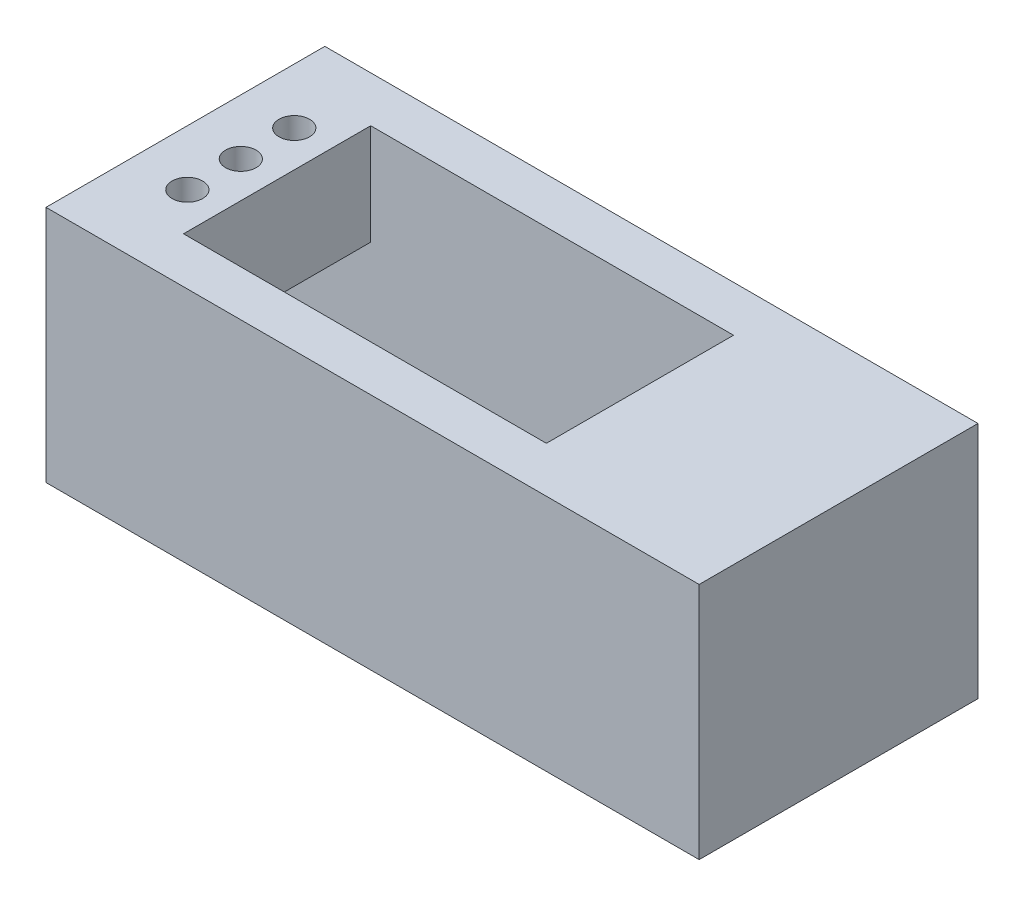
ISO-10303-21;
HEADER;
FILE_DESCRIPTION(('STEP AP214'),'2;1');
FILE_NAME('part.step','',(''),(''),'','','');
FILE_SCHEMA(('AUTOMOTIVE_DESIGN { 1 0 10303 214 1 1 1 1 }'));
ENDSEC;
DATA;
#1=APPLICATION_CONTEXT('core data for automotive mechanical design processes');
#2=APPLICATION_PROTOCOL_DEFINITION('international standard','automotive_design',2000,#1);
#3=PRODUCT_CONTEXT('',#1,'mechanical');
#4=PRODUCT('Part','Part','',(#3));
#5=PRODUCT_RELATED_PRODUCT_CATEGORY('part','',(#4));
#6=PRODUCT_DEFINITION_FORMATION('','',#4);
#7=PRODUCT_DEFINITION_CONTEXT('part definition',#1,'design');
#8=PRODUCT_DEFINITION('design','',#6,#7);
#9=PRODUCT_DEFINITION_SHAPE('','',#8);
#10=(LENGTH_UNIT() NAMED_UNIT(*) SI_UNIT(.MILLI.,.METRE.));
#11=(NAMED_UNIT(*) PLANE_ANGLE_UNIT() SI_UNIT($,.RADIAN.));
#12=(NAMED_UNIT(*) SI_UNIT($,.STERADIAN.) SOLID_ANGLE_UNIT());
#13=UNCERTAINTY_MEASURE_WITH_UNIT(LENGTH_MEASURE(1.E-05),#10,'distance_accuracy_value','');
#14=(GEOMETRIC_REPRESENTATION_CONTEXT(3) GLOBAL_UNCERTAINTY_ASSIGNED_CONTEXT((#13)) GLOBAL_UNIT_ASSIGNED_CONTEXT((#10,
#11,#12)) REPRESENTATION_CONTEXT('',''));
#15=CARTESIAN_POINT('',(0.,0.,0.));
#16=DIRECTION('',(0.,0.,1.));
#17=DIRECTION('',(1.,0.,0.));
#18=AXIS2_PLACEMENT_3D('',#15,#16,#17);
#19=CARTESIAN_POINT('',(-11.875,15.6,6.125));
#20=DIRECTION('',(1.,0.,0.));
#21=DIRECTION('',(0.,0.,-1.));
#22=AXIS2_PLACEMENT_3D('',#19,#20,#21);
#23=PLANE('',#22);
#24=DIRECTION('',(0.,-1.,0.));
#25=VECTOR('',#24,1.);
#26=CARTESIAN_POINT('',(-11.875,15.6,6.125));
#27=LINE('',#26,#25);
#28=CARTESIAN_POINT('',(-11.875,15.6,6.125));
#29=VERTEX_POINT('',#28);
#30=CARTESIAN_POINT('',(-11.875,9.,6.125));
#31=VERTEX_POINT('',#30);
#32=EDGE_CURVE('E63',#29,#31,#27,.T.);
#33=ORIENTED_EDGE('',*,*,#32,.T.);
#34=DIRECTION('',(0.,0.,-1.));
#35=VECTOR('',#34,1.);
#36=CARTESIAN_POINT('',(-11.875,9.,6.125));
#37=LINE('',#36,#35);
#38=CARTESIAN_POINT('',(-11.875,9.,-6.125));
#39=VERTEX_POINT('',#38);
#40=EDGE_CURVE('E121',#31,#39,#37,.T.);
#41=ORIENTED_EDGE('',*,*,#40,.T.);
#42=DIRECTION('',(0.,-1.,0.));
#43=VECTOR('',#42,1.);
#44=CARTESIAN_POINT('',(-11.875,15.6,-6.125));
#45=LINE('',#44,#43);
#46=CARTESIAN_POINT('',(-11.875,15.6,-6.125));
#47=VERTEX_POINT('',#46);
#48=EDGE_CURVE('E174',#47,#39,#45,.T.);
#49=ORIENTED_EDGE('',*,*,#48,.F.);
#50=DIRECTION('',(0.,0.,1.));
#51=VECTOR('',#50,1.);
#52=CARTESIAN_POINT('',(-11.875,15.6,6.125));
#53=LINE('',#52,#51);
#54=EDGE_CURVE('E155',#47,#29,#53,.T.);
#55=ORIENTED_EDGE('',*,*,#54,.T.);
#56=EDGE_LOOP('',(#33,#41,#49,#55));
#57=FACE_BOUND('',#56,.T.);
#58=ADVANCED_FACE('F39',(#57),#23,.T.);
#59=CARTESIAN_POINT('',(0.,15.6,0.));
#60=DIRECTION('',(0.,1.,0.));
#61=DIRECTION('',(0.,0.,1.));
#62=AXIS2_PLACEMENT_3D('',#59,#60,#61);
#63=PLANE('',#62);
#64=CARTESIAN_POINT('',(-14.245,15.6,-3.495));
#65=DIRECTION('',(0.,1.,0.));
#66=DIRECTION('',(0.,0.,1.));
#67=AXIS2_PLACEMENT_3D('',#64,#65,#66);
#68=CIRCLE('',#67,1.);
#69=CARTESIAN_POINT('',(-14.245,15.6,-2.495));
#70=VERTEX_POINT('',#69);
#71=EDGE_CURVE('E405',#70,#70,#68,.T.);
#72=ORIENTED_EDGE('',*,*,#71,.F.);
#73=EDGE_LOOP('',(#72));
#74=FACE_BOUND('',#73,.T.);
#75=CARTESIAN_POINT('',(-14.245,15.6,0.00500000000000023));
#76=DIRECTION('',(0.,1.,0.));
#77=DIRECTION('',(0.,0.,1.));
#78=AXIS2_PLACEMENT_3D('',#75,#76,#77);
#79=CIRCLE('',#78,1.);
#80=CARTESIAN_POINT('',(-14.245,15.6,1.005));
#81=VERTEX_POINT('',#80);
#82=EDGE_CURVE('E415',#81,#81,#79,.T.);
#83=ORIENTED_EDGE('',*,*,#82,.F.);
#84=EDGE_LOOP('',(#83));
#85=FACE_BOUND('',#84,.T.);
#86=CARTESIAN_POINT('',(-14.245,15.6,3.505));
#87=DIRECTION('',(0.,1.,0.));
#88=DIRECTION('',(0.,0.,1.));
#89=AXIS2_PLACEMENT_3D('',#86,#87,#88);
#90=CIRCLE('',#89,1.);
#91=CARTESIAN_POINT('',(-14.245,15.6,4.505));
#92=VERTEX_POINT('',#91);
#93=EDGE_CURVE('E422',#92,#92,#90,.T.);
#94=ORIENTED_EDGE('',*,*,#93,.F.);
#95=EDGE_LOOP('',(#94));
#96=FACE_BOUND('',#95,.T.);
#97=DIRECTION('',(1.,0.,0.));
#98=VECTOR('',#97,1.);
#99=CARTESIAN_POINT('',(-17.875,15.6,9.125));
#100=LINE('',#99,#98);
#101=CARTESIAN_POINT('',(-17.875,15.6,9.125));
#102=VERTEX_POINT('',#101);
#103=CARTESIAN_POINT('',(24.875,15.6,9.125));
#104=VERTEX_POINT('',#103);
#105=EDGE_CURVE('E183',#102,#104,#100,.T.);
#106=ORIENTED_EDGE('',*,*,#105,.T.);
#107=DIRECTION('',(0.,0.,-1.));
#108=VECTOR('',#107,1.);
#109=CARTESIAN_POINT('',(24.875,15.6,9.125));
#110=LINE('',#109,#108);
#111=CARTESIAN_POINT('',(24.875,15.6,-9.125));
#112=VERTEX_POINT('',#111);
#113=EDGE_CURVE('E186',#104,#112,#110,.T.);
#114=ORIENTED_EDGE('',*,*,#113,.T.);
#115=DIRECTION('',(-1.,0.,0.));
#116=VECTOR('',#115,1.);
#117=CARTESIAN_POINT('',(24.875,15.6,-9.125));
#118=LINE('',#117,#116);
#119=CARTESIAN_POINT('',(-17.875,15.6,-9.125));
#120=VERTEX_POINT('',#119);
#121=EDGE_CURVE('E190',#112,#120,#118,.T.);
#122=ORIENTED_EDGE('',*,*,#121,.T.);
#123=DIRECTION('',(0.,0.,1.));
#124=VECTOR('',#123,1.);
#125=CARTESIAN_POINT('',(-17.875,15.6,-9.125));
#126=LINE('',#125,#124);
#127=EDGE_CURVE('E193',#120,#102,#126,.T.);
#128=ORIENTED_EDGE('',*,*,#127,.T.);
#129=EDGE_LOOP('',(#106,#114,#122,#128));
#130=FACE_BOUND('',#129,.T.);
#131=DIRECTION('',(-1.,0.,0.));
#132=VECTOR('',#131,1.);
#133=CARTESIAN_POINT('',(-11.875,15.6,-6.125));
#134=LINE('',#133,#132);
#135=CARTESIAN_POINT('',(11.875,15.6,-6.125));
#136=VERTEX_POINT('',#135);
#137=EDGE_CURVE('E152',#136,#47,#134,.T.);
#138=ORIENTED_EDGE('',*,*,#137,.F.);
#139=DIRECTION('',(0.,0.,-1.));
#140=VECTOR('',#139,1.);
#141=CARTESIAN_POINT('',(11.875,15.6,6.125));
#142=LINE('',#141,#140);
#143=CARTESIAN_POINT('',(11.875,15.6,6.125));
#144=VERTEX_POINT('',#143);
#145=EDGE_CURVE('E149',#144,#136,#142,.T.);
#146=ORIENTED_EDGE('',*,*,#145,.F.);
#147=DIRECTION('',(1.,0.,0.));
#148=VECTOR('',#147,1.);
#149=CARTESIAN_POINT('',(-11.875,15.6,6.125));
#150=LINE('',#149,#148);
#151=EDGE_CURVE('E158',#29,#144,#150,.T.);
#152=ORIENTED_EDGE('',*,*,#151,.F.);
#153=ORIENTED_EDGE('',*,*,#54,.F.);
#154=EDGE_LOOP('',(#138,#146,#152,#153));
#155=FACE_BOUND('',#154,.T.);
#156=ADVANCED_FACE('F235',(#74,#85,#96,#130,#155),#63,.T.);
#157=CARTESIAN_POINT('',(0.,0.,0.));
#158=DIRECTION('',(0.,1.,0.));
#159=DIRECTION('',(0.,0.,1.));
#160=AXIS2_PLACEMENT_3D('',#157,#158,#159);
#161=PLANE('',#160);
#162=DIRECTION('',(0.,0.,1.));
#163=VECTOR('',#162,1.);
#164=CARTESIAN_POINT('',(-17.875,0.,-9.125));
#165=LINE('',#164,#163);
#166=CARTESIAN_POINT('',(-17.875,0.,6.125));
#167=VERTEX_POINT('',#166);
#168=CARTESIAN_POINT('',(-17.875,0.,9.125));
#169=VERTEX_POINT('',#168);
#170=EDGE_CURVE('E206',#167,#169,#165,.T.);
#171=ORIENTED_EDGE('',*,*,#170,.F.);
#172=DIRECTION('',(1.,0.,0.));
#173=VECTOR('',#172,1.);
#174=CARTESIAN_POINT('',(-11.875,0.,6.125));
#175=LINE('',#174,#173);
#176=CARTESIAN_POINT('',(11.875,0.,6.125));
#177=VERTEX_POINT('',#176);
#178=EDGE_CURVE('E129',#167,#177,#175,.T.);
#179=ORIENTED_EDGE('',*,*,#178,.T.);
#180=DIRECTION('',(0.,0.,-1.));
#181=VECTOR('',#180,1.);
#182=CARTESIAN_POINT('',(11.875,0.,6.125));
#183=LINE('',#182,#181);
#184=CARTESIAN_POINT('',(11.875,0.,-6.125));
#185=VERTEX_POINT('',#184);
#186=EDGE_CURVE('E148',#177,#185,#183,.T.);
#187=ORIENTED_EDGE('',*,*,#186,.T.);
#188=DIRECTION('',(-1.,0.,0.));
#189=VECTOR('',#188,1.);
#190=CARTESIAN_POINT('',(-11.875,0.,-6.125));
#191=LINE('',#190,#189);
#192=CARTESIAN_POINT('',(-17.875,0.,-6.125));
#193=VERTEX_POINT('',#192);
#194=EDGE_CURVE('E165',#185,#193,#191,.T.);
#195=ORIENTED_EDGE('',*,*,#194,.T.);
#196=CARTESIAN_POINT('',(-17.875,0.,-9.125));
#197=VERTEX_POINT('',#196);
#198=EDGE_CURVE('E187',#197,#193,#165,.T.);
#199=ORIENTED_EDGE('',*,*,#198,.F.);
#200=DIRECTION('',(-1.,0.,0.));
#201=VECTOR('',#200,1.);
#202=CARTESIAN_POINT('',(-17.875,0.,-9.125));
#203=LINE('',#202,#201);
#204=CARTESIAN_POINT('',(24.875,0.,-9.125));
#205=VERTEX_POINT('',#204);
#206=EDGE_CURVE('E203',#205,#197,#203,.T.);
#207=ORIENTED_EDGE('',*,*,#206,.F.);
#208=DIRECTION('',(0.,0.,-1.));
#209=VECTOR('',#208,1.);
#210=CARTESIAN_POINT('',(24.875,0.,9.125));
#211=LINE('',#210,#209);
#212=CARTESIAN_POINT('',(24.875,0.,9.125));
#213=VERTEX_POINT('',#212);
#214=EDGE_CURVE('E199',#213,#205,#211,.T.);
#215=ORIENTED_EDGE('',*,*,#214,.F.);
#216=DIRECTION('',(1.,0.,0.));
#217=VECTOR('',#216,1.);
#218=CARTESIAN_POINT('',(17.875,0.,9.125));
#219=LINE('',#218,#217);
#220=EDGE_CURVE('E182',#169,#213,#219,.T.);
#221=ORIENTED_EDGE('',*,*,#220,.F.);
#222=EDGE_LOOP('',(#171,#179,#187,#195,#199,#207,#215,#221));
#223=FACE_BOUND('',#222,.T.);
#224=ADVANCED_FACE('F229',(#223),#161,.F.);
#225=CARTESIAN_POINT('',(17.875,15.6,9.125));
#226=DIRECTION('',(0.,0.,-1.));
#227=DIRECTION('',(-1.,0.,0.));
#228=AXIS2_PLACEMENT_3D('',#225,#226,#227);
#229=PLANE('',#228);
#230=ORIENTED_EDGE('',*,*,#220,.T.);
#231=DIRECTION('',(0.,-1.,0.));
#232=VECTOR('',#231,1.);
#233=CARTESIAN_POINT('',(24.875,15.6,9.125));
#234=LINE('',#233,#232);
#235=EDGE_CURVE('E11',#104,#213,#234,.T.);
#236=ORIENTED_EDGE('',*,*,#235,.F.);
#237=ORIENTED_EDGE('',*,*,#105,.F.);
#238=DIRECTION('',(0.,-1.,0.));
#239=VECTOR('',#238,1.);
#240=CARTESIAN_POINT('',(-17.875,15.6,9.125));
#241=LINE('',#240,#239);
#242=EDGE_CURVE('E196',#102,#169,#241,.T.);
#243=ORIENTED_EDGE('',*,*,#242,.T.);
#244=EDGE_LOOP('',(#230,#236,#237,#243));
#245=FACE_BOUND('',#244,.T.);
#246=ADVANCED_FACE('F41',(#245),#229,.F.);
#247=CARTESIAN_POINT('',(24.875,15.6,9.125));
#248=DIRECTION('',(-1.,0.,0.));
#249=DIRECTION('',(0.,0.,1.));
#250=AXIS2_PLACEMENT_3D('',#247,#248,#249);
#251=PLANE('',#250);
#252=ORIENTED_EDGE('',*,*,#214,.T.);
#253=DIRECTION('',(0.,-1.,0.));
#254=VECTOR('',#253,1.);
#255=CARTESIAN_POINT('',(24.875,15.6,-9.125));
#256=LINE('',#255,#254);
#257=EDGE_CURVE('E48',#112,#205,#256,.T.);
#258=ORIENTED_EDGE('',*,*,#257,.F.);
#259=ORIENTED_EDGE('',*,*,#113,.F.);
#260=ORIENTED_EDGE('',*,*,#235,.T.);
#261=EDGE_LOOP('',(#252,#258,#259,#260));
#262=FACE_BOUND('',#261,.T.);
#263=ADVANCED_FACE('F224',(#262),#251,.F.);
#264=CARTESIAN_POINT('',(-17.875,15.6,-9.125));
#265=DIRECTION('',(0.,0.,1.));
#266=DIRECTION('',(1.,0.,0.));
#267=AXIS2_PLACEMENT_3D('',#264,#265,#266);
#268=PLANE('',#267);
#269=ORIENTED_EDGE('',*,*,#206,.T.);
#270=DIRECTION('',(0.,-1.,0.));
#271=VECTOR('',#270,1.);
#272=CARTESIAN_POINT('',(-17.875,15.6,-9.125));
#273=LINE('',#272,#271);
#274=EDGE_CURVE('E212',#120,#197,#273,.T.);
#275=ORIENTED_EDGE('',*,*,#274,.F.);
#276=ORIENTED_EDGE('',*,*,#121,.F.);
#277=ORIENTED_EDGE('',*,*,#257,.T.);
#278=EDGE_LOOP('',(#269,#275,#276,#277));
#279=FACE_BOUND('',#278,.T.);
#280=ADVANCED_FACE('F220',(#279),#268,.F.);
#281=CARTESIAN_POINT('',(-17.875,15.6,-9.125));
#282=DIRECTION('',(1.,0.,0.));
#283=DIRECTION('',(0.,0.,-1.));
#284=AXIS2_PLACEMENT_3D('',#281,#282,#283);
#285=PLANE('',#284);
#286=DIRECTION('',(0.,0.,1.));
#287=VECTOR('',#286,1.);
#288=CARTESIAN_POINT('',(-17.875,9.,-6.125));
#289=LINE('',#288,#287);
#290=CARTESIAN_POINT('',(-17.875,9.,-6.125));
#291=VERTEX_POINT('',#290);
#292=CARTESIAN_POINT('',(-17.875,9.,6.125));
#293=VERTEX_POINT('',#292);
#294=EDGE_CURVE('E119',#291,#293,#289,.T.);
#295=ORIENTED_EDGE('',*,*,#294,.T.);
#296=DIRECTION('',(0.,1.,0.));
#297=VECTOR('',#296,1.);
#298=CARTESIAN_POINT('',(-17.875,0.,6.125));
#299=LINE('',#298,#297);
#300=EDGE_CURVE('E126',#167,#293,#299,.T.);
#301=ORIENTED_EDGE('',*,*,#300,.F.);
#302=ORIENTED_EDGE('',*,*,#170,.T.);
#303=ORIENTED_EDGE('',*,*,#242,.F.);
#304=ORIENTED_EDGE('',*,*,#127,.F.);
#305=ORIENTED_EDGE('',*,*,#274,.T.);
#306=ORIENTED_EDGE('',*,*,#198,.T.);
#307=DIRECTION('',(0.,1.,0.));
#308=VECTOR('',#307,1.);
#309=CARTESIAN_POINT('',(-17.875,0.,-6.125));
#310=LINE('',#309,#308);
#311=EDGE_CURVE('E123',#193,#291,#310,.T.);
#312=ORIENTED_EDGE('',*,*,#311,.T.);
#313=EDGE_LOOP('',(#295,#301,#302,#303,#304,#305,#306,#312));
#314=FACE_BOUND('',#313,.T.);
#315=ADVANCED_FACE('F135',(#314),#285,.F.);
#316=CARTESIAN_POINT('',(11.875,15.6,6.125));
#317=DIRECTION('',(-1.,0.,0.));
#318=DIRECTION('',(0.,0.,1.));
#319=AXIS2_PLACEMENT_3D('',#316,#317,#318);
#320=PLANE('',#319);
#321=ORIENTED_EDGE('',*,*,#186,.F.);
#322=DIRECTION('',(0.,-1.,0.));
#323=VECTOR('',#322,1.);
#324=CARTESIAN_POINT('',(11.875,15.6,6.125));
#325=LINE('',#324,#323);
#326=EDGE_CURVE('E161',#144,#177,#325,.T.);
#327=ORIENTED_EDGE('',*,*,#326,.F.);
#328=ORIENTED_EDGE('',*,*,#145,.T.);
#329=DIRECTION('',(0.,-1.,0.));
#330=VECTOR('',#329,1.);
#331=CARTESIAN_POINT('',(11.875,15.6,-6.125));
#332=LINE('',#331,#330);
#333=EDGE_CURVE('E178',#136,#185,#332,.T.);
#334=ORIENTED_EDGE('',*,*,#333,.T.);
#335=EDGE_LOOP('',(#321,#327,#328,#334));
#336=FACE_BOUND('',#335,.T.);
#337=ADVANCED_FACE('F258',(#336),#320,.T.);
#338=CARTESIAN_POINT('',(-11.875,15.6,-6.125));
#339=DIRECTION('',(0.,0.,1.));
#340=DIRECTION('',(1.,0.,0.));
#341=AXIS2_PLACEMENT_3D('',#338,#339,#340);
#342=PLANE('',#341);
#343=ORIENTED_EDGE('',*,*,#48,.T.);
#344=DIRECTION('',(-1.,0.,0.));
#345=VECTOR('',#344,1.);
#346=CARTESIAN_POINT('',(-7.875,9.,-6.125));
#347=LINE('',#346,#345);
#348=EDGE_CURVE('E55',#39,#291,#347,.T.);
#349=ORIENTED_EDGE('',*,*,#348,.T.);
#350=ORIENTED_EDGE('',*,*,#311,.F.);
#351=ORIENTED_EDGE('',*,*,#194,.F.);
#352=ORIENTED_EDGE('',*,*,#333,.F.);
#353=ORIENTED_EDGE('',*,*,#137,.T.);
#354=EDGE_LOOP('',(#343,#349,#350,#351,#352,#353));
#355=FACE_BOUND('',#354,.T.);
#356=ADVANCED_FACE('F255',(#355),#342,.T.);
#357=CARTESIAN_POINT('',(-11.875,15.6,6.125));
#358=DIRECTION('',(0.,0.,-1.));
#359=DIRECTION('',(-1.,0.,0.));
#360=AXIS2_PLACEMENT_3D('',#357,#358,#359);
#361=PLANE('',#360);
#362=ORIENTED_EDGE('',*,*,#178,.F.);
#363=ORIENTED_EDGE('',*,*,#300,.T.);
#364=DIRECTION('',(-1.,0.,0.));
#365=VECTOR('',#364,1.);
#366=CARTESIAN_POINT('',(-7.875,9.,6.125));
#367=LINE('',#366,#365);
#368=EDGE_CURVE('E115',#31,#293,#367,.T.);
#369=ORIENTED_EDGE('',*,*,#368,.F.);
#370=ORIENTED_EDGE('',*,*,#32,.F.);
#371=ORIENTED_EDGE('',*,*,#151,.T.);
#372=ORIENTED_EDGE('',*,*,#326,.T.);
#373=EDGE_LOOP('',(#362,#363,#369,#370,#371,#372));
#374=FACE_BOUND('',#373,.T.);
#375=ADVANCED_FACE('F127',(#374),#361,.T.);
#376=CARTESIAN_POINT('',(-7.875,9.,-6.125));
#377=DIRECTION('',(0.,-1.,0.));
#378=DIRECTION('',(0.,0.,-1.));
#379=AXIS2_PLACEMENT_3D('',#376,#377,#378);
#380=PLANE('',#379);
#381=ORIENTED_EDGE('',*,*,#368,.T.);
#382=ORIENTED_EDGE('',*,*,#294,.F.);
#383=ORIENTED_EDGE('',*,*,#348,.F.);
#384=ORIENTED_EDGE('',*,*,#40,.F.);
#385=EDGE_LOOP('',(#381,#382,#383,#384));
#386=FACE_BOUND('',#385,.T.);
#387=ADVANCED_FACE('F117',(#386),#380,.T.);
#388=CARTESIAN_POINT('',(-14.245,12.6,3.505));
#389=DIRECTION('',(0.,1.,0.));
#390=DIRECTION('',(0.,0.,1.));
#391=AXIS2_PLACEMENT_3D('',#388,#389,#390);
#392=CYLINDRICAL_SURFACE('',#391,1.);
#393=CARTESIAN_POINT('',(-14.245,12.6,3.505));
#394=DIRECTION('',(0.,1.,0.));
#395=DIRECTION('',(0.,0.,1.));
#396=AXIS2_PLACEMENT_3D('',#393,#394,#395);
#397=CIRCLE('',#396,1.);
#398=CARTESIAN_POINT('',(-14.245,12.6,4.505));
#399=VERTEX_POINT('',#398);
#400=EDGE_CURVE('E419',#399,#399,#397,.T.);
#401=ORIENTED_EDGE('',*,*,#400,.F.);
#402=EDGE_LOOP('',(#401));
#403=FACE_BOUND('',#402,.T.);
#404=ORIENTED_EDGE('',*,*,#93,.T.);
#405=EDGE_LOOP('',(#404));
#406=FACE_BOUND('',#405,.T.);
#407=ADVANCED_FACE('F294',(#403,#406),#392,.F.);
#408=CARTESIAN_POINT('',(-14.245,12.6,3.505));
#409=DIRECTION('',(0.,1.,0.));
#410=DIRECTION('',(0.,0.,1.));
#411=AXIS2_PLACEMENT_3D('',#408,#409,#410);
#412=PLANE('',#411);
#413=ORIENTED_EDGE('',*,*,#400,.T.);
#414=EDGE_LOOP('',(#413));
#415=FACE_BOUND('',#414,.T.);
#416=ADVANCED_FACE('F301',(#415),#412,.T.);
#417=CARTESIAN_POINT('',(-14.245,12.6,0.00500000000000023));
#418=DIRECTION('',(0.,1.,0.));
#419=DIRECTION('',(0.,0.,1.));
#420=AXIS2_PLACEMENT_3D('',#417,#418,#419);
#421=CYLINDRICAL_SURFACE('',#420,1.);
#422=CARTESIAN_POINT('',(-14.245,12.6,0.00500000000000023));
#423=DIRECTION('',(0.,1.,0.));
#424=DIRECTION('',(0.,0.,1.));
#425=AXIS2_PLACEMENT_3D('',#422,#423,#424);
#426=CIRCLE('',#425,1.);
#427=CARTESIAN_POINT('',(-14.245,12.6,1.005));
#428=VERTEX_POINT('',#427);
#429=EDGE_CURVE('E409',#428,#428,#426,.T.);
#430=ORIENTED_EDGE('',*,*,#429,.F.);
#431=EDGE_LOOP('',(#430));
#432=FACE_BOUND('',#431,.T.);
#433=ORIENTED_EDGE('',*,*,#82,.T.);
#434=EDGE_LOOP('',(#433));
#435=FACE_BOUND('',#434,.T.);
#436=ADVANCED_FACE('F309',(#432,#435),#421,.F.);
#437=CARTESIAN_POINT('',(-14.245,12.6,0.00500000000000023));
#438=DIRECTION('',(0.,1.,0.));
#439=DIRECTION('',(0.,0.,1.));
#440=AXIS2_PLACEMENT_3D('',#437,#438,#439);
#441=PLANE('',#440);
#442=ORIENTED_EDGE('',*,*,#429,.T.);
#443=EDGE_LOOP('',(#442));
#444=FACE_BOUND('',#443,.T.);
#445=ADVANCED_FACE('F317',(#444),#441,.T.);
#446=CARTESIAN_POINT('',(-14.245,12.6,-3.495));
#447=DIRECTION('',(0.,1.,0.));
#448=DIRECTION('',(0.,0.,1.));
#449=AXIS2_PLACEMENT_3D('',#446,#447,#448);
#450=CYLINDRICAL_SURFACE('',#449,1.);
#451=CARTESIAN_POINT('',(-14.245,12.6,-3.495));
#452=DIRECTION('',(0.,1.,0.));
#453=DIRECTION('',(0.,0.,1.));
#454=AXIS2_PLACEMENT_3D('',#451,#452,#453);
#455=CIRCLE('',#454,1.);
#456=CARTESIAN_POINT('',(-14.245,12.6,-2.495));
#457=VERTEX_POINT('',#456);
#458=EDGE_CURVE('E133',#457,#457,#455,.T.);
#459=ORIENTED_EDGE('',*,*,#458,.F.);
#460=EDGE_LOOP('',(#459));
#461=FACE_BOUND('',#460,.T.);
#462=ORIENTED_EDGE('',*,*,#71,.T.);
#463=EDGE_LOOP('',(#462));
#464=FACE_BOUND('',#463,.T.);
#465=ADVANCED_FACE('F325',(#461,#464),#450,.F.);
#466=CARTESIAN_POINT('',(-14.245,12.6,-3.495));
#467=DIRECTION('',(0.,1.,0.));
#468=DIRECTION('',(0.,0.,1.));
#469=AXIS2_PLACEMENT_3D('',#466,#467,#468);
#470=PLANE('',#469);
#471=ORIENTED_EDGE('',*,*,#458,.T.);
#472=EDGE_LOOP('',(#471));
#473=FACE_BOUND('',#472,.T.);
#474=ADVANCED_FACE('F333',(#473),#470,.T.);
#475=CLOSED_SHELL('',(#58,#156,#224,#246,#263,#280,#315,#337,#356,#375,#387,#407,#416,#436,#445,
#465,#474));
#476=MANIFOLD_SOLID_BREP('B2',#475);
#477=ADVANCED_BREP_SHAPE_REPRESENTATION('',(#18,#476),#14);
#478=SHAPE_DEFINITION_REPRESENTATION(#9,#477);
ENDSEC;
END-ISO-10303-21;
